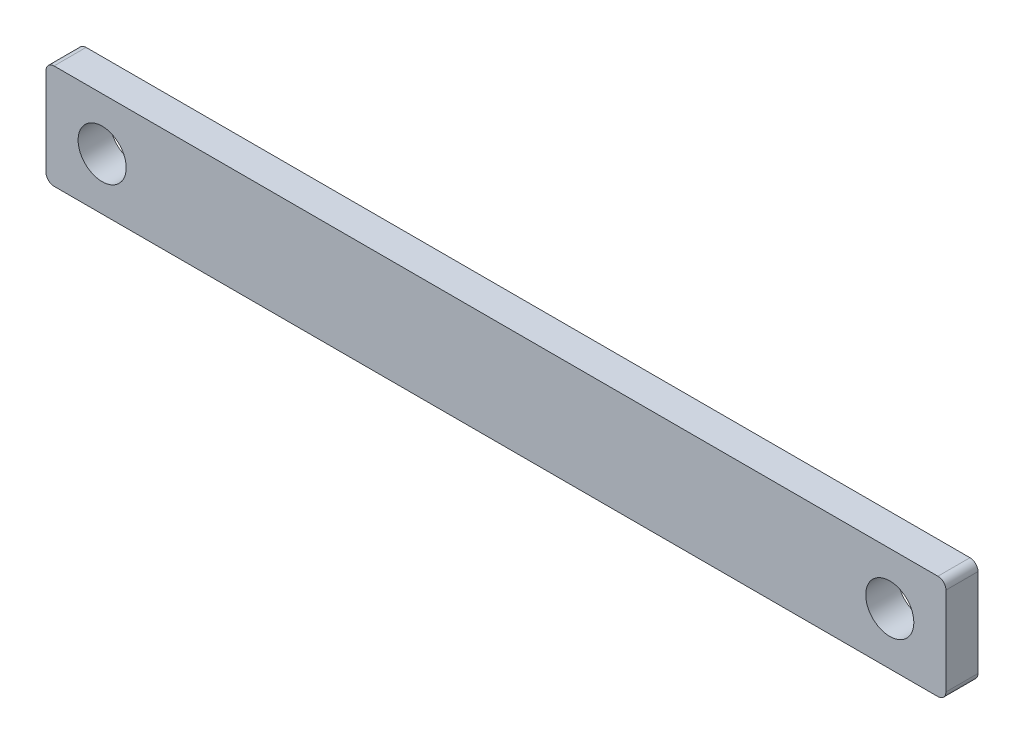
ISO-10303-21;
HEADER;
FILE_DESCRIPTION(('STEP AP214'),'2;1');
FILE_NAME('part.step','',(''),(''),'','','');
FILE_SCHEMA(('AUTOMOTIVE_DESIGN { 1 0 10303 214 1 1 1 1 }'));
ENDSEC;
DATA;
#1=APPLICATION_CONTEXT('core data for automotive mechanical design processes');
#2=APPLICATION_PROTOCOL_DEFINITION('international standard','automotive_design',2000,#1);
#3=PRODUCT_CONTEXT('',#1,'mechanical');
#4=PRODUCT('Part','Part','',(#3));
#5=PRODUCT_RELATED_PRODUCT_CATEGORY('part','',(#4));
#6=PRODUCT_DEFINITION_FORMATION('','',#4);
#7=PRODUCT_DEFINITION_CONTEXT('part definition',#1,'design');
#8=PRODUCT_DEFINITION('design','',#6,#7);
#9=PRODUCT_DEFINITION_SHAPE('','',#8);
#10=(LENGTH_UNIT() NAMED_UNIT(*) SI_UNIT(.MILLI.,.METRE.));
#11=(NAMED_UNIT(*) PLANE_ANGLE_UNIT() SI_UNIT($,.RADIAN.));
#12=(NAMED_UNIT(*) SI_UNIT($,.STERADIAN.) SOLID_ANGLE_UNIT());
#13=UNCERTAINTY_MEASURE_WITH_UNIT(LENGTH_MEASURE(1.E-05),#10,'distance_accuracy_value','');
#14=(GEOMETRIC_REPRESENTATION_CONTEXT(3) GLOBAL_UNCERTAINTY_ASSIGNED_CONTEXT((#13)) GLOBAL_UNIT_ASSIGNED_CONTEXT((#10,
#11,#12)) REPRESENTATION_CONTEXT('',''));
#15=CARTESIAN_POINT('',(0.,0.,0.));
#16=DIRECTION('',(0.,0.,1.));
#17=DIRECTION('',(1.,0.,0.));
#18=AXIS2_PLACEMENT_3D('',#15,#16,#17);
#19=CARTESIAN_POINT('',(1112.,120.,40.));
#20=DIRECTION('',(0.,0.,-1.));
#21=DIRECTION('',(-1.,0.,0.));
#22=AXIS2_PLACEMENT_3D('',#19,#20,#21);
#23=PLANE('',#22);
#24=CARTESIAN_POINT('',(1112.,120.,40.));
#25=DIRECTION('',(0.,0.,1.));
#26=DIRECTION('',(-1.,0.,0.));
#27=AXIS2_PLACEMENT_3D('',#24,#25,#26);
#28=CIRCLE('',#27,9.99999999999989);
#29=CARTESIAN_POINT('',(1122.,120.,40.));
#30=VERTEX_POINT('',#29);
#31=CARTESIAN_POINT('',(1112.,130.,40.));
#32=VERTEX_POINT('',#31);
#33=EDGE_CURVE('E129',#30,#32,#28,.T.);
#34=ORIENTED_EDGE('',*,*,#33,.T.);
#35=DIRECTION('',(-1.,0.,0.));
#36=VECTOR('',#35,1.);
#37=CARTESIAN_POINT('',(10.,130.,40.));
#38=LINE('',#37,#36);
#39=CARTESIAN_POINT('',(10.,130.,40.));
#40=VERTEX_POINT('',#39);
#41=EDGE_CURVE('E77',#32,#40,#38,.T.);
#42=ORIENTED_EDGE('',*,*,#41,.T.);
#43=CARTESIAN_POINT('',(10.,120.,40.));
#44=DIRECTION('',(0.,0.,1.));
#45=DIRECTION('',(-1.,0.,0.));
#46=AXIS2_PLACEMENT_3D('',#43,#44,#45);
#47=CIRCLE('',#46,10.);
#48=CARTESIAN_POINT('',(0.,120.,40.));
#49=VERTEX_POINT('',#48);
#50=EDGE_CURVE('E144',#40,#49,#47,.T.);
#51=ORIENTED_EDGE('',*,*,#50,.T.);
#52=DIRECTION('',(0.,-1.,0.));
#53=VECTOR('',#52,1.);
#54=CARTESIAN_POINT('',(0.,10.,40.));
#55=LINE('',#54,#53);
#56=CARTESIAN_POINT('',(0.,10.,40.));
#57=VERTEX_POINT('',#56);
#58=EDGE_CURVE('E157',#49,#57,#55,.T.);
#59=ORIENTED_EDGE('',*,*,#58,.T.);
#60=CARTESIAN_POINT('',(10.,10.,40.));
#61=DIRECTION('',(0.,0.,1.));
#62=DIRECTION('',(-1.,0.,0.));
#63=AXIS2_PLACEMENT_3D('',#60,#61,#62);
#64=CIRCLE('',#63,10.);
#65=CARTESIAN_POINT('',(10.,0.,40.));
#66=VERTEX_POINT('',#65);
#67=EDGE_CURVE('E96',#57,#66,#64,.T.);
#68=ORIENTED_EDGE('',*,*,#67,.T.);
#69=DIRECTION('',(1.,0.,0.));
#70=VECTOR('',#69,1.);
#71=CARTESIAN_POINT('',(10.,0.,40.));
#72=LINE('',#71,#70);
#73=CARTESIAN_POINT('',(1112.,0.,40.));
#74=VERTEX_POINT('',#73);
#75=EDGE_CURVE('E90',#66,#74,#72,.T.);
#76=ORIENTED_EDGE('',*,*,#75,.T.);
#77=CARTESIAN_POINT('',(1112.,10.,40.));
#78=DIRECTION('',(0.,0.,1.));
#79=DIRECTION('',(1.,0.,0.));
#80=AXIS2_PLACEMENT_3D('',#77,#78,#79);
#81=CIRCLE('',#80,10.);
#82=CARTESIAN_POINT('',(1122.,10.,40.));
#83=VERTEX_POINT('',#82);
#84=EDGE_CURVE('E94',#74,#83,#81,.T.);
#85=ORIENTED_EDGE('',*,*,#84,.T.);
#86=DIRECTION('',(0.,1.,0.));
#87=VECTOR('',#86,1.);
#88=CARTESIAN_POINT('',(1122.,10.,40.));
#89=LINE('',#88,#87);
#90=EDGE_CURVE('E34',#83,#30,#89,.T.);
#91=ORIENTED_EDGE('',*,*,#90,.T.);
#92=EDGE_LOOP('',(#34,#42,#51,#59,#68,#76,#85,#91));
#93=FACE_BOUND('',#92,.T.);
#94=CARTESIAN_POINT('',(70.,65.,40.));
#95=DIRECTION('',(0.,0.,1.));
#96=DIRECTION('',(1.,0.,0.));
#97=AXIS2_PLACEMENT_3D('',#94,#95,#96);
#98=CIRCLE('',#97,30.);
#99=CARTESIAN_POINT('',(100.,65.,40.));
#100=VERTEX_POINT('',#99);
#101=EDGE_CURVE('E118',#100,#100,#98,.T.);
#102=ORIENTED_EDGE('',*,*,#101,.F.);
#103=EDGE_LOOP('',(#102));
#104=FACE_BOUND('',#103,.T.);
#105=CARTESIAN_POINT('',(1052.,65.,40.));
#106=DIRECTION('',(0.,0.,1.));
#107=DIRECTION('',(1.,0.,0.));
#108=AXIS2_PLACEMENT_3D('',#105,#106,#107);
#109=CIRCLE('',#108,30.);
#110=CARTESIAN_POINT('',(1082.,65.,40.));
#111=VERTEX_POINT('',#110);
#112=EDGE_CURVE('E166',#111,#111,#109,.T.);
#113=ORIENTED_EDGE('',*,*,#112,.F.);
#114=EDGE_LOOP('',(#113));
#115=FACE_BOUND('',#114,.T.);
#116=ADVANCED_FACE('F17',(#93,#104,#115),#23,.F.);
#117=CARTESIAN_POINT('',(1112.,120.,0.));
#118=DIRECTION('',(0.,0.,-1.));
#119=DIRECTION('',(-1.,0.,0.));
#120=AXIS2_PLACEMENT_3D('',#117,#118,#119);
#121=PLANE('',#120);
#122=CARTESIAN_POINT('',(70.,65.,0.));
#123=DIRECTION('',(0.,0.,1.));
#124=DIRECTION('',(1.,0.,0.));
#125=AXIS2_PLACEMENT_3D('',#122,#123,#124);
#126=CIRCLE('',#125,30.);
#127=CARTESIAN_POINT('',(100.,65.,0.));
#128=VERTEX_POINT('',#127);
#129=EDGE_CURVE('E163',#128,#128,#126,.T.);
#130=ORIENTED_EDGE('',*,*,#129,.T.);
#131=EDGE_LOOP('',(#130));
#132=FACE_BOUND('',#131,.T.);
#133=CARTESIAN_POINT('',(1112.,120.,0.));
#134=DIRECTION('',(0.,0.,1.));
#135=DIRECTION('',(-1.,0.,0.));
#136=AXIS2_PLACEMENT_3D('',#133,#134,#135);
#137=CIRCLE('',#136,9.99999999999989);
#138=CARTESIAN_POINT('',(1122.,120.,0.));
#139=VERTEX_POINT('',#138);
#140=CARTESIAN_POINT('',(1112.,130.,0.));
#141=VERTEX_POINT('',#140);
#142=EDGE_CURVE('E114',#139,#141,#137,.T.);
#143=ORIENTED_EDGE('',*,*,#142,.F.);
#144=DIRECTION('',(0.,1.,0.));
#145=VECTOR('',#144,1.);
#146=CARTESIAN_POINT('',(1122.,10.,0.));
#147=LINE('',#146,#145);
#148=CARTESIAN_POINT('',(1122.,10.,0.));
#149=VERTEX_POINT('',#148);
#150=EDGE_CURVE('E69',#149,#139,#147,.T.);
#151=ORIENTED_EDGE('',*,*,#150,.F.);
#152=CARTESIAN_POINT('',(1112.,10.,0.));
#153=DIRECTION('',(0.,0.,1.));
#154=DIRECTION('',(1.,0.,0.));
#155=AXIS2_PLACEMENT_3D('',#152,#153,#154);
#156=CIRCLE('',#155,10.);
#157=CARTESIAN_POINT('',(1112.,0.,0.));
#158=VERTEX_POINT('',#157);
#159=EDGE_CURVE('E63',#158,#149,#156,.T.);
#160=ORIENTED_EDGE('',*,*,#159,.F.);
#161=DIRECTION('',(1.,0.,0.));
#162=VECTOR('',#161,1.);
#163=CARTESIAN_POINT('',(10.,0.,0.));
#164=LINE('',#163,#162);
#165=CARTESIAN_POINT('',(10.,0.,0.));
#166=VERTEX_POINT('',#165);
#167=EDGE_CURVE('E104',#166,#158,#164,.T.);
#168=ORIENTED_EDGE('',*,*,#167,.F.);
#169=CARTESIAN_POINT('',(10.,10.,0.));
#170=DIRECTION('',(0.,0.,1.));
#171=DIRECTION('',(-1.,0.,0.));
#172=AXIS2_PLACEMENT_3D('',#169,#170,#171);
#173=CIRCLE('',#172,10.);
#174=CARTESIAN_POINT('',(0.,10.,0.));
#175=VERTEX_POINT('',#174);
#176=EDGE_CURVE('E124',#175,#166,#173,.T.);
#177=ORIENTED_EDGE('',*,*,#176,.F.);
#178=DIRECTION('',(0.,-1.,0.));
#179=VECTOR('',#178,1.);
#180=CARTESIAN_POINT('',(0.,10.,0.));
#181=LINE('',#180,#179);
#182=CARTESIAN_POINT('',(0.,120.,0.));
#183=VERTEX_POINT('',#182);
#184=EDGE_CURVE('E122',#183,#175,#181,.T.);
#185=ORIENTED_EDGE('',*,*,#184,.F.);
#186=CARTESIAN_POINT('',(10.,120.,0.));
#187=DIRECTION('',(0.,0.,1.));
#188=DIRECTION('',(-1.,0.,0.));
#189=AXIS2_PLACEMENT_3D('',#186,#187,#188);
#190=CIRCLE('',#189,10.);
#191=CARTESIAN_POINT('',(10.,130.,0.));
#192=VERTEX_POINT('',#191);
#193=EDGE_CURVE('E120',#192,#183,#190,.T.);
#194=ORIENTED_EDGE('',*,*,#193,.F.);
#195=DIRECTION('',(-1.,0.,0.));
#196=VECTOR('',#195,1.);
#197=CARTESIAN_POINT('',(10.,130.,0.));
#198=LINE('',#197,#196);
#199=EDGE_CURVE('E117',#141,#192,#198,.T.);
#200=ORIENTED_EDGE('',*,*,#199,.F.);
#201=EDGE_LOOP('',(#143,#151,#160,#168,#177,#185,#194,#200));
#202=FACE_BOUND('',#201,.T.);
#203=CARTESIAN_POINT('',(1052.,65.,0.));
#204=DIRECTION('',(0.,0.,1.));
#205=DIRECTION('',(1.,0.,0.));
#206=AXIS2_PLACEMENT_3D('',#203,#204,#205);
#207=CIRCLE('',#206,30.);
#208=CARTESIAN_POINT('',(1082.,65.,0.));
#209=VERTEX_POINT('',#208);
#210=EDGE_CURVE('E169',#209,#209,#207,.T.);
#211=ORIENTED_EDGE('',*,*,#210,.T.);
#212=EDGE_LOOP('',(#211));
#213=FACE_BOUND('',#212,.T.);
#214=ADVANCED_FACE('F148',(#132,#202,#213),#121,.T.);
#215=CARTESIAN_POINT('',(1112.,120.,40.));
#216=DIRECTION('',(0.,0.,-1.));
#217=DIRECTION('',(-1.,0.,0.));
#218=AXIS2_PLACEMENT_3D('',#215,#216,#217);
#219=CYLINDRICAL_SURFACE('',#218,9.99999999999989);
#220=ORIENTED_EDGE('',*,*,#142,.T.);
#221=DIRECTION('',(0.,0.,-1.));
#222=VECTOR('',#221,1.);
#223=CARTESIAN_POINT('',(1112.,130.,40.));
#224=LINE('',#223,#222);
#225=EDGE_CURVE('E11',#32,#141,#224,.T.);
#226=ORIENTED_EDGE('',*,*,#225,.F.);
#227=ORIENTED_EDGE('',*,*,#33,.F.);
#228=DIRECTION('',(0.,0.,-1.));
#229=VECTOR('',#228,1.);
#230=CARTESIAN_POINT('',(1122.,120.,40.));
#231=LINE('',#230,#229);
#232=EDGE_CURVE('E110',#30,#139,#231,.T.);
#233=ORIENTED_EDGE('',*,*,#232,.T.);
#234=EDGE_LOOP('',(#220,#226,#227,#233));
#235=FACE_BOUND('',#234,.T.);
#236=ADVANCED_FACE('F19',(#235),#219,.T.);
#237=CARTESIAN_POINT('',(10.,130.,40.));
#238=DIRECTION('',(0.,-1.,0.));
#239=DIRECTION('',(0.,0.,-1.));
#240=AXIS2_PLACEMENT_3D('',#237,#238,#239);
#241=PLANE('',#240);
#242=ORIENTED_EDGE('',*,*,#199,.T.);
#243=DIRECTION('',(0.,0.,-1.));
#244=VECTOR('',#243,1.);
#245=CARTESIAN_POINT('',(10.,130.,40.));
#246=LINE('',#245,#244);
#247=EDGE_CURVE('E26',#40,#192,#246,.T.);
#248=ORIENTED_EDGE('',*,*,#247,.F.);
#249=ORIENTED_EDGE('',*,*,#41,.F.);
#250=ORIENTED_EDGE('',*,*,#225,.T.);
#251=EDGE_LOOP('',(#242,#248,#249,#250));
#252=FACE_BOUND('',#251,.T.);
#253=ADVANCED_FACE('F203',(#252),#241,.F.);
#254=CARTESIAN_POINT('',(10.,120.,40.));
#255=DIRECTION('',(0.,0.,-1.));
#256=DIRECTION('',(-1.,0.,0.));
#257=AXIS2_PLACEMENT_3D('',#254,#255,#256);
#258=CYLINDRICAL_SURFACE('',#257,10.);
#259=ORIENTED_EDGE('',*,*,#193,.T.);
#260=DIRECTION('',(0.,0.,-1.));
#261=VECTOR('',#260,1.);
#262=CARTESIAN_POINT('',(0.,120.,40.));
#263=LINE('',#262,#261);
#264=EDGE_CURVE('E136',#49,#183,#263,.T.);
#265=ORIENTED_EDGE('',*,*,#264,.F.);
#266=ORIENTED_EDGE('',*,*,#50,.F.);
#267=ORIENTED_EDGE('',*,*,#247,.T.);
#268=EDGE_LOOP('',(#259,#265,#266,#267));
#269=FACE_BOUND('',#268,.T.);
#270=ADVANCED_FACE('F142',(#269),#258,.T.);
#271=CARTESIAN_POINT('',(0.,10.,40.));
#272=DIRECTION('',(1.,0.,0.));
#273=DIRECTION('',(0.,0.,-1.));
#274=AXIS2_PLACEMENT_3D('',#271,#272,#273);
#275=PLANE('',#274);
#276=ORIENTED_EDGE('',*,*,#184,.T.);
#277=DIRECTION('',(0.,0.,-1.));
#278=VECTOR('',#277,1.);
#279=CARTESIAN_POINT('',(0.,10.,40.));
#280=LINE('',#279,#278);
#281=EDGE_CURVE('E133',#57,#175,#280,.T.);
#282=ORIENTED_EDGE('',*,*,#281,.F.);
#283=ORIENTED_EDGE('',*,*,#58,.F.);
#284=ORIENTED_EDGE('',*,*,#264,.T.);
#285=EDGE_LOOP('',(#276,#282,#283,#284));
#286=FACE_BOUND('',#285,.T.);
#287=ADVANCED_FACE('F153',(#286),#275,.F.);
#288=CARTESIAN_POINT('',(10.,10.,40.));
#289=DIRECTION('',(0.,0.,-1.));
#290=DIRECTION('',(-1.,0.,0.));
#291=AXIS2_PLACEMENT_3D('',#288,#289,#290);
#292=CYLINDRICAL_SURFACE('',#291,10.);
#293=ORIENTED_EDGE('',*,*,#176,.T.);
#294=DIRECTION('',(0.,0.,-1.));
#295=VECTOR('',#294,1.);
#296=CARTESIAN_POINT('',(10.,0.,40.));
#297=LINE('',#296,#295);
#298=EDGE_CURVE('E105',#66,#166,#297,.T.);
#299=ORIENTED_EDGE('',*,*,#298,.F.);
#300=ORIENTED_EDGE('',*,*,#67,.F.);
#301=ORIENTED_EDGE('',*,*,#281,.T.);
#302=EDGE_LOOP('',(#293,#299,#300,#301));
#303=FACE_BOUND('',#302,.T.);
#304=ADVANCED_FACE('F156',(#303),#292,.T.);
#305=CARTESIAN_POINT('',(10.,0.,40.));
#306=DIRECTION('',(0.,1.,0.));
#307=DIRECTION('',(0.,0.,1.));
#308=AXIS2_PLACEMENT_3D('',#305,#306,#307);
#309=PLANE('',#308);
#310=ORIENTED_EDGE('',*,*,#167,.T.);
#311=DIRECTION('',(0.,0.,-1.));
#312=VECTOR('',#311,1.);
#313=CARTESIAN_POINT('',(1112.,0.,40.));
#314=LINE('',#313,#312);
#315=EDGE_CURVE('E101',#74,#158,#314,.T.);
#316=ORIENTED_EDGE('',*,*,#315,.F.);
#317=ORIENTED_EDGE('',*,*,#75,.F.);
#318=ORIENTED_EDGE('',*,*,#298,.T.);
#319=EDGE_LOOP('',(#310,#316,#317,#318));
#320=FACE_BOUND('',#319,.T.);
#321=ADVANCED_FACE('F102',(#320),#309,.F.);
#322=CARTESIAN_POINT('',(1112.,10.,40.));
#323=DIRECTION('',(0.,0.,-1.));
#324=DIRECTION('',(-1.,0.,0.));
#325=AXIS2_PLACEMENT_3D('',#322,#323,#324);
#326=CYLINDRICAL_SURFACE('',#325,10.);
#327=ORIENTED_EDGE('',*,*,#159,.T.);
#328=DIRECTION('',(0.,0.,-1.));
#329=VECTOR('',#328,1.);
#330=CARTESIAN_POINT('',(1122.,10.,40.));
#331=LINE('',#330,#329);
#332=EDGE_CURVE('E106',#83,#149,#331,.T.);
#333=ORIENTED_EDGE('',*,*,#332,.F.);
#334=ORIENTED_EDGE('',*,*,#84,.F.);
#335=ORIENTED_EDGE('',*,*,#315,.T.);
#336=EDGE_LOOP('',(#327,#333,#334,#335));
#337=FACE_BOUND('',#336,.T.);
#338=ADVANCED_FACE('F108',(#337),#326,.T.);
#339=CARTESIAN_POINT('',(1122.,10.,40.));
#340=DIRECTION('',(-1.,0.,0.));
#341=DIRECTION('',(0.,-1.,0.));
#342=AXIS2_PLACEMENT_3D('',#339,#340,#341);
#343=PLANE('',#342);
#344=ORIENTED_EDGE('',*,*,#150,.T.);
#345=ORIENTED_EDGE('',*,*,#232,.F.);
#346=ORIENTED_EDGE('',*,*,#90,.F.);
#347=ORIENTED_EDGE('',*,*,#332,.T.);
#348=EDGE_LOOP('',(#344,#345,#346,#347));
#349=FACE_BOUND('',#348,.T.);
#350=ADVANCED_FACE('F191',(#349),#343,.F.);
#351=CARTESIAN_POINT('',(70.,65.,40.));
#352=DIRECTION('',(0.,0.,-1.));
#353=DIRECTION('',(-1.,0.,0.));
#354=AXIS2_PLACEMENT_3D('',#351,#352,#353);
#355=CYLINDRICAL_SURFACE('',#354,30.);
#356=ORIENTED_EDGE('',*,*,#101,.T.);
#357=EDGE_LOOP('',(#356));
#358=FACE_BOUND('',#357,.T.);
#359=ORIENTED_EDGE('',*,*,#129,.F.);
#360=EDGE_LOOP('',(#359));
#361=FACE_BOUND('',#360,.T.);
#362=ADVANCED_FACE('F188',(#358,#361),#355,.F.);
#363=CARTESIAN_POINT('',(1052.,65.,40.));
#364=DIRECTION('',(0.,0.,-1.));
#365=DIRECTION('',(-1.,0.,0.));
#366=AXIS2_PLACEMENT_3D('',#363,#364,#365);
#367=CYLINDRICAL_SURFACE('',#366,30.);
#368=ORIENTED_EDGE('',*,*,#112,.T.);
#369=EDGE_LOOP('',(#368));
#370=FACE_BOUND('',#369,.T.);
#371=ORIENTED_EDGE('',*,*,#210,.F.);
#372=EDGE_LOOP('',(#371));
#373=FACE_BOUND('',#372,.T.);
#374=ADVANCED_FACE('F175',(#370,#373),#367,.F.);
#375=CLOSED_SHELL('',(#116,#214,#236,#253,#270,#287,#304,#321,#338,#350,#362,#374));
#376=MANIFOLD_SOLID_BREP('B1',#375);
#377=ADVANCED_BREP_SHAPE_REPRESENTATION('',(#18,#376),#14);
#378=SHAPE_DEFINITION_REPRESENTATION(#9,#377);
ENDSEC;
END-ISO-10303-21;
